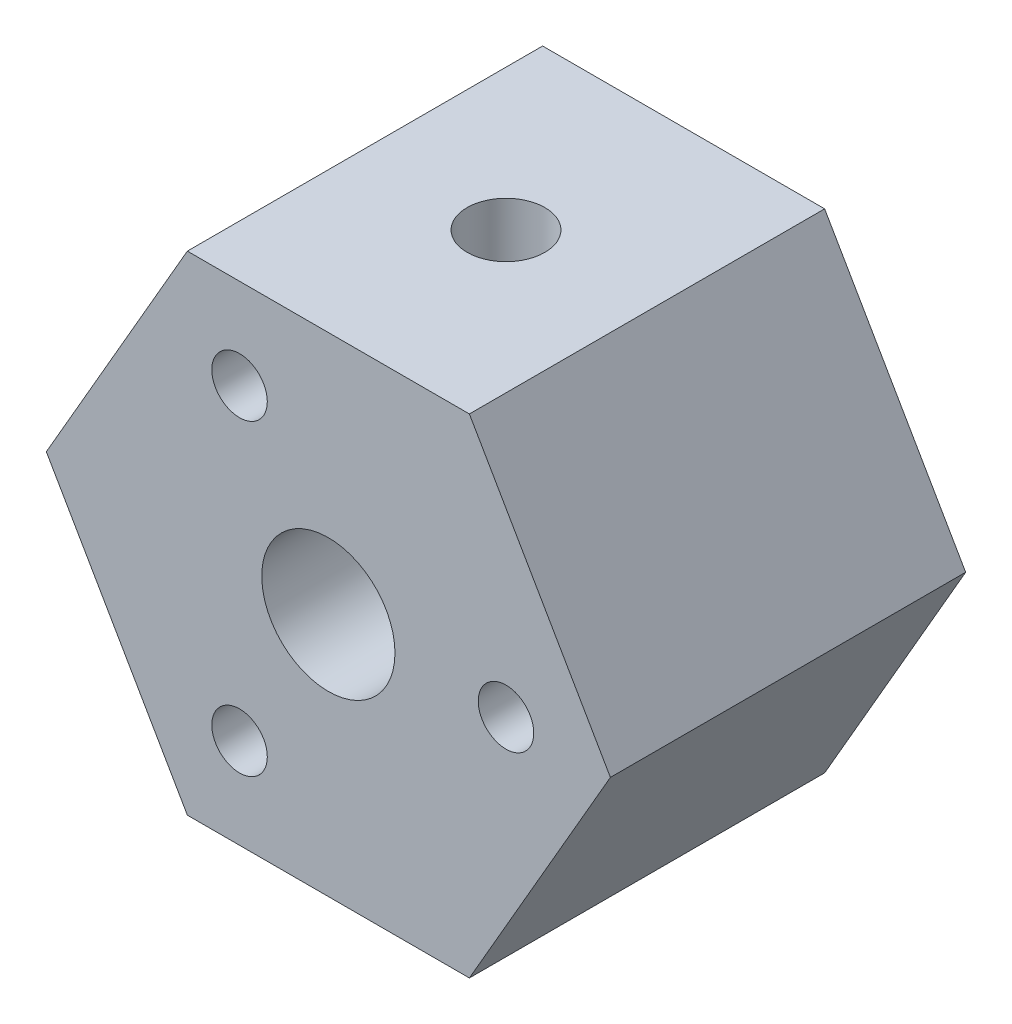
ISO-10303-21;
HEADER;
FILE_DESCRIPTION(('STEP AP214'),'2;1');
FILE_NAME('part.step','',(''),(''),'','','');
FILE_SCHEMA(('AUTOMOTIVE_DESIGN { 1 0 10303 214 1 1 1 1 }'));
ENDSEC;
DATA;
#1=APPLICATION_CONTEXT('core data for automotive mechanical design processes');
#2=APPLICATION_PROTOCOL_DEFINITION('international standard','automotive_design',2000,#1);
#3=PRODUCT_CONTEXT('',#1,'mechanical');
#4=PRODUCT('Part','Part','',(#3));
#5=PRODUCT_RELATED_PRODUCT_CATEGORY('part','',(#4));
#6=PRODUCT_DEFINITION_FORMATION('','',#4);
#7=PRODUCT_DEFINITION_CONTEXT('part definition',#1,'design');
#8=PRODUCT_DEFINITION('design','',#6,#7);
#9=PRODUCT_DEFINITION_SHAPE('','',#8);
#10=(LENGTH_UNIT() NAMED_UNIT(*) SI_UNIT(.MILLI.,.METRE.));
#11=(NAMED_UNIT(*) PLANE_ANGLE_UNIT() SI_UNIT($,.RADIAN.));
#12=(NAMED_UNIT(*) SI_UNIT($,.STERADIAN.) SOLID_ANGLE_UNIT());
#13=UNCERTAINTY_MEASURE_WITH_UNIT(LENGTH_MEASURE(1.E-05),#10,'distance_accuracy_value','');
#14=(GEOMETRIC_REPRESENTATION_CONTEXT(3) GLOBAL_UNCERTAINTY_ASSIGNED_CONTEXT((#13)) GLOBAL_UNIT_ASSIGNED_CONTEXT((#10,
#11,#12)) REPRESENTATION_CONTEXT('',''));
#15=CARTESIAN_POINT('',(0.,0.,0.));
#16=DIRECTION('',(0.,0.,1.));
#17=DIRECTION('',(1.,0.,0.));
#18=AXIS2_PLACEMENT_3D('',#15,#16,#17);
#19=CARTESIAN_POINT('',(0.,0.,16.));
#20=DIRECTION('',(0.,0.,-1.));
#21=DIRECTION('',(-1.,0.,0.));
#22=AXIS2_PLACEMENT_3D('',#19,#20,#21);
#23=CYLINDRICAL_SURFACE('',#22,3.);
#24=CARTESIAN_POINT('',(1.75000000000003,-2.43669858620222,8.));
#25=CARTESIAN_POINT('',(1.75000045184637,-2.43669821091809,8.08863889528146));
#26=CARTESIAN_POINT('',(1.74322391194515,-2.44160788460741,8.17727610566655));
#27=CARTESIAN_POINT('',(1.71658538535332,-2.46040390641729,8.35160919117936));
#28=CARTESIAN_POINT('',(1.6967099102009,-2.47429950740482,8.43730193848041));
#29=CARTESIAN_POINT('',(1.64515183199162,-2.50886819103835,8.60287126283056));
#30=CARTESIAN_POINT('',(1.61354922075019,-2.52949524548536,8.68278295832127));
#31=CARTESIAN_POINT('',(1.53968773008135,-2.57511999485221,8.83613005381451));
#32=CARTESIAN_POINT('',(1.49742543895694,-2.60011908828342,8.90956337019559));
#33=CARTESIAN_POINT('',(1.39777992638198,-2.6551471198592,9.05712914540586));
#34=CARTESIAN_POINT('',(1.33921745197904,-2.68542397458176,9.13037305047407));
#35=CARTESIAN_POINT('',(1.21105723337495,-2.74560714742444,9.26672916596511));
#36=CARTESIAN_POINT('',(1.14145191954032,-2.77551319609255,9.32983436635982));
#37=CARTESIAN_POINT('',(0.984713035802176,-2.83514492694845,9.45036523985617));
#38=CARTESIAN_POINT('',(0.896522073845278,-2.86455244924704,9.50658875248923));
#39=CARTESIAN_POINT('',(0.709891668525868,-2.91640205141093,9.60298275090372));
#40=CARTESIAN_POINT('',(0.611461168794474,-2.93885014282858,9.64316709998003));
#41=CARTESIAN_POINT('',(0.416649273147403,-2.97241689810005,9.70243957405883));
#42=CARTESIAN_POINT('',(0.320901861024355,-2.98438308199891,9.72311932171921));
#43=CARTESIAN_POINT('',(0.126621897573,-2.99890385217236,9.74815170248301));
#44=CARTESIAN_POINT('',(0.0280918555916253,-3.00146666139126,9.75251860070146));
#45=CARTESIAN_POINT('',(-0.156495068538387,-2.99716974401528,9.74514362164978));
#46=CARTESIAN_POINT('',(-0.242658294594978,-2.99138089155147,9.7352327113407));
#47=CARTESIAN_POINT('',(-0.411844523266103,-2.97281444912443,9.70302645014485));
#48=CARTESIAN_POINT('',(-0.494867293660748,-2.96003634341921,9.68073018533203));
#49=CARTESIAN_POINT('',(-0.656364893028908,-2.92848341823655,9.62451791220763));
#50=CARTESIAN_POINT('',(-0.734799910253137,-2.90966331095227,9.5905140051559));
#51=CARTESIAN_POINT('',(-0.884967789919802,-2.86756375772183,9.51212239017886));
#52=CARTESIAN_POINT('',(-0.956698764094629,-2.84428306099948,9.46773176898207));
#53=CARTESIAN_POINT('',(-1.10031993041435,-2.79209374170039,9.36401124963256));
#54=CARTESIAN_POINT('',(-1.17126676062858,-2.76284559232329,9.3035466701393));
#55=CARTESIAN_POINT('',(-1.30259918374286,-2.70341339686187,9.17233444943293));
#56=CARTESIAN_POINT('',(-1.36297110984747,-2.67322819817169,9.10157371463528));
#57=CARTESIAN_POINT('',(-1.47789838153365,-2.61160884024912,8.94282325363876));
#58=CARTESIAN_POINT('',(-1.53115297544717,-2.58038307336383,8.85380162897644));
#59=CARTESIAN_POINT('',(-1.62161168095686,-2.52452387398176,8.66609151711749));
#60=CARTESIAN_POINT('',(-1.65884482652414,-2.49987854748403,8.56742091753687));
#61=CARTESIAN_POINT('',(-1.70853720110658,-2.46608582417188,8.38723400908313));
#62=CARTESIAN_POINT('',(-1.72477506877108,-2.4546504879456,8.3071884246211));
#63=CARTESIAN_POINT('',(-1.74590213357918,-2.43967272746158,8.14491752518462));
#64=CARTESIAN_POINT('',(-1.75080313330492,-2.43612209475394,8.06269456734191));
#65=CARTESIAN_POINT('',(-1.74898039241036,-2.43743053869139,7.89837879671839));
#66=CARTESIAN_POINT('',(-1.74224625907731,-2.44229713376169,7.81628616591415));
#67=CARTESIAN_POINT('',(-1.71753388251392,-2.45973523645838,7.65463785956955));
#68=CARTESIAN_POINT('',(-1.69954714130058,-2.47231256709753,7.57508414919058));
#69=CARTESIAN_POINT('',(-1.65302928692428,-2.50365278676386,7.41981300232488));
#70=CARTESIAN_POINT('',(-1.62442278126805,-2.52245979649396,7.34412750759557));
#71=CARTESIAN_POINT('',(-1.5576569269978,-2.5642256405431,7.198351056267));
#72=CARTESIAN_POINT('',(-1.51949380330517,-2.58718611457638,7.12826232497924));
#73=CARTESIAN_POINT('',(-1.42709875316825,-2.63944389498439,6.98288114369688));
#74=CARTESIAN_POINT('',(-1.37123101284255,-2.66915133905922,6.90877361007517));
#75=CARTESIAN_POINT('',(-1.24852240970031,-2.72870860976122,6.77025848430392));
#76=CARTESIAN_POINT('',(-1.18167183667124,-2.75855853948195,6.70585957330208));
#77=CARTESIAN_POINT('',(-1.02989256043401,-2.81899071549213,6.58137629446211));
#78=CARTESIAN_POINT('',(-0.943778122538562,-2.8492813890616,6.5225803141602));
#79=CARTESIAN_POINT('',(-0.760910913608829,-2.90346015966261,6.4206181998119));
#80=CARTESIAN_POINT('',(-0.66416617741938,-2.92735304610789,6.37744036540367));
#81=CARTESIAN_POINT('',(-0.470674024896558,-2.9643532208793,6.31163710741645));
#82=CARTESIAN_POINT('',(-0.374522814239373,-2.97815986600772,6.28766454631349));
#83=CARTESIAN_POINT('',(-0.178706533702731,-2.9962804721505,6.25633526026649));
#84=CARTESIAN_POINT('',(-0.0790450111450977,-3.00060375186925,6.24896222382968));
#85=CARTESIAN_POINT('',(0.107655929988335,-2.99934002716751,6.25113381764859));
#86=CARTESIAN_POINT('',(0.194734538061914,-2.99491069180817,6.25870210291732));
#87=CARTESIAN_POINT('',(0.366137785941637,-2.97881697494109,6.28652985331473));
#88=CARTESIAN_POINT('',(0.450462322323444,-2.96715232205176,6.30678979448107));
#89=CARTESIAN_POINT('',(0.613761582363603,-2.93771241495244,6.35892953327495));
#90=CARTESIAN_POINT('',(0.692762016439801,-2.91996949045702,6.39074790577612));
#91=CARTESIAN_POINT('',(0.844368647802338,-2.87979165338306,6.46485559813608));
#92=CARTESIAN_POINT('',(0.916973235651973,-2.85735556459278,6.50714754339559));
#93=CARTESIAN_POINT('',(1.06230015031835,-2.80678961708283,6.60623486612087));
#94=CARTESIAN_POINT('',(1.13415977100249,-2.77830505779608,6.66411294922417));
#95=CARTESIAN_POINT('',(1.26772272997668,-2.71996380471867,6.79011398971481));
#96=CARTESIAN_POINT('',(1.32941393272297,-2.69010552501784,6.85824900545822));
#97=CARTESIAN_POINT('',(1.4480520863921,-2.62832782018946,7.01201089040555));
#98=CARTESIAN_POINT('',(1.50365362198234,-2.59656217758449,7.09874664118109));
#99=CARTESIAN_POINT('',(1.59932168084085,-2.53876100901197,7.2821349745036));
#100=CARTESIAN_POINT('',(1.63940729371892,-2.51271845895713,7.37877518492351));
#101=CARTESIAN_POINT('',(1.69663483894559,-2.47435095867368,7.56237960377671));
#102=CARTESIAN_POINT('',(1.7165399134438,-2.46043560953241,7.6481420552006));
#103=CARTESIAN_POINT('',(1.74321337060435,-2.44161571370901,7.82260633197994));
#104=CARTESIAN_POINT('',(1.74999954786264,-2.43669896172808,7.9113040095238));
#105=CARTESIAN_POINT('',(1.75000000000003,-2.43669858620222,8.));
#106=B_SPLINE_CURVE_WITH_KNOTS('',3,(#24,#25,#26,#27,#28,#29,#30,#31,#32,#33,#34,#35,#36,#37,
#38,#39,#40,#41,#42,#43,#44,#45,#46,#47,#48,#49,#50,#51,#52,#53,#54,#55,#56,#57,#58,#59,#60,#61,
#62,#63,#64,#65,#66,#67,#68,#69,#70,#71,#72,#73,#74,#75,#76,#77,#78,#79,#80,#81,#82,#83,#84,#85,
#86,#87,#88,#89,#90,#91,#92,#93,#94,#95,#96,#97,#98,#99,#100,#101,#102,#103,#104,#105),
.UNSPECIFIED.,.T.,.F.,(4,2,2,2,2,2,2,2,2,2,2,2,2,2,2,2,2,2,2,2,2,2,2,2,2,2,2,2,2,2,2,2,2,2,2,2,
2,2,2,2,4),(0.,0.265545218763682,0.531364307474163,0.795402587763074,1.0595254826214,
1.35398659107803,1.64865042554404,1.97283142487701,2.29673161156482,2.5910478996181,
2.88510675625999,3.14464340280145,3.40419920332162,3.66574779852172,3.9273698411442,
4.21928633023893,4.5115773466454,4.83494305243834,5.15772026336276,5.40406403188872,
5.65015122128839,5.89645833389886,6.142951682854,6.39122950133275,6.63960555026167,
6.93078691809871,7.22222712635784,7.5462672305399,7.87006407425508,8.16844648867915,
8.4665355699542,8.72782114336879,8.98911651764958,9.24904312841219,9.50903496080326,
9.79757898950315,10.0864649272872,10.4083273312523,10.7297924718895,10.9958699008298,
11.2615861659037),.UNSPECIFIED.);
#107=CARTESIAN_POINT('',(1.75000000000003,-2.43669858620222,8.));
#108=VERTEX_POINT('',#107);
#109=EDGE_CURVE('E141',#108,#108,#106,.T.);
#110=ORIENTED_EDGE('',*,*,#109,.T.);
#111=EDGE_LOOP('',(#110));
#112=FACE_BOUND('',#111,.T.);
#113=CARTESIAN_POINT('',(0.,0.,16.));
#114=DIRECTION('',(0.,0.,1.));
#115=DIRECTION('',(1.,0.,0.));
#116=AXIS2_PLACEMENT_3D('',#113,#114,#115);
#117=CIRCLE('',#116,3.);
#118=CARTESIAN_POINT('',(3.,0.,16.));
#119=VERTEX_POINT('',#118);
#120=EDGE_CURVE('E129',#119,#119,#117,.T.);
#121=ORIENTED_EDGE('',*,*,#120,.T.);
#122=EDGE_LOOP('',(#121));
#123=FACE_BOUND('',#122,.T.);
#124=CARTESIAN_POINT('',(0.,0.,0.));
#125=DIRECTION('',(0.,0.,1.));
#126=DIRECTION('',(1.,0.,0.));
#127=AXIS2_PLACEMENT_3D('',#124,#125,#126);
#128=CIRCLE('',#127,3.);
#129=CARTESIAN_POINT('',(3.,0.,0.));
#130=VERTEX_POINT('',#129);
#131=EDGE_CURVE('E189',#130,#130,#128,.T.);
#132=ORIENTED_EDGE('',*,*,#131,.F.);
#133=EDGE_LOOP('',(#132));
#134=FACE_BOUND('',#133,.T.);
#135=CARTESIAN_POINT('',(1.74999999999998,2.43669858620226,8.));
#136=CARTESIAN_POINT('',(1.75000045184632,2.43669821091813,7.91136110471855));
#137=CARTESIAN_POINT('',(1.74322391194509,2.44160788460744,7.82272389433345));
#138=CARTESIAN_POINT('',(1.71658538535327,2.46040390641732,7.64839080882064));
#139=CARTESIAN_POINT('',(1.69670991020084,2.47429950740485,7.56269806151959));
#140=CARTESIAN_POINT('',(1.64515183199157,2.50886819103838,7.39712873716944));
#141=CARTESIAN_POINT('',(1.61354922075014,2.5294952454854,7.31721704167874));
#142=CARTESIAN_POINT('',(1.5396877300813,2.57511999485224,7.16386994618549));
#143=CARTESIAN_POINT('',(1.49742543895688,2.60011908828345,7.09043662980441));
#144=CARTESIAN_POINT('',(1.39777992638192,2.65514711985923,6.94287085459414));
#145=CARTESIAN_POINT('',(1.33921745197899,2.68542397458179,6.86962694952593));
#146=CARTESIAN_POINT('',(1.21105723337489,2.74560714742447,6.73327083403489));
#147=CARTESIAN_POINT('',(1.14145191954026,2.77551319609257,6.67016563364018));
#148=CARTESIAN_POINT('',(0.984713035802116,2.83514492694847,6.54963476014383));
#149=CARTESIAN_POINT('',(0.896522073845218,2.86455244924706,6.49341124751077));
#150=CARTESIAN_POINT('',(0.709891668525806,2.91640205141094,6.39701724909628));
#151=CARTESIAN_POINT('',(0.611461168794412,2.9388501428286,6.35683290001997));
#152=CARTESIAN_POINT('',(0.41664927314734,2.97241689810006,6.29756042594118));
#153=CARTESIAN_POINT('',(0.320901861024292,2.98438308199892,6.27688067828079));
#154=CARTESIAN_POINT('',(0.126621897572937,2.99890385217237,6.25184829751699));
#155=CARTESIAN_POINT('',(0.0280918555915622,3.00146666139126,6.24748139929854));
#156=CARTESIAN_POINT('',(-0.15649506853845,2.99716974401528,6.25485637835022));
#157=CARTESIAN_POINT('',(-0.242658294595041,2.99138089155147,6.2647672886593));
#158=CARTESIAN_POINT('',(-0.411844523266166,2.97281444912442,6.29697354985515));
#159=CARTESIAN_POINT('',(-0.49486729366081,2.9600363434192,6.31926981466797));
#160=CARTESIAN_POINT('',(-0.65636489302897,2.92848341823654,6.37548208779237));
#161=CARTESIAN_POINT('',(-0.734799910253198,2.90966331095225,6.4094859948441));
#162=CARTESIAN_POINT('',(-0.884967789919862,2.86756375772182,6.48787760982114));
#163=CARTESIAN_POINT('',(-0.956698764094689,2.84428306099946,6.53226823101793));
#164=CARTESIAN_POINT('',(-1.10031993041441,2.79209374170036,6.63598875036744));
#165=CARTESIAN_POINT('',(-1.17126676062863,2.76284559232327,6.6964533298607));
#166=CARTESIAN_POINT('',(-1.30259918374292,2.70341339686185,6.82766555056707));
#167=CARTESIAN_POINT('',(-1.36297110984752,2.67322819817166,6.89842628536472));
#168=CARTESIAN_POINT('',(-1.47789838153371,2.61160884024909,7.05717674636124));
#169=CARTESIAN_POINT('',(-1.53115297544722,2.5803830733638,7.14619837102356));
#170=CARTESIAN_POINT('',(-1.62161168095691,2.52452387398173,7.33390848288251));
#171=CARTESIAN_POINT('',(-1.65884482652419,2.499878547484,7.43257908246313));
#172=CARTESIAN_POINT('',(-1.70853720110663,2.46608582417185,7.61276599091687));
#173=CARTESIAN_POINT('',(-1.72477506877113,2.45465048794557,7.69281157537891));
#174=CARTESIAN_POINT('',(-1.74590213357923,2.43967272746154,7.85508247481538));
#175=CARTESIAN_POINT('',(-1.75080313330497,2.4361220947539,7.9373054326581));
#176=CARTESIAN_POINT('',(-1.74898039241041,2.43743053869136,8.10162120328162));
#177=CARTESIAN_POINT('',(-1.74224625907736,2.44229713376165,8.18371383408586));
#178=CARTESIAN_POINT('',(-1.71753388251397,2.45973523645835,8.34536214043046));
#179=CARTESIAN_POINT('',(-1.69954714130063,2.47231256709749,8.42491585080943));
#180=CARTESIAN_POINT('',(-1.65302928692433,2.50365278676383,8.58018699767513));
#181=CARTESIAN_POINT('',(-1.6244227812681,2.52245979649393,8.65587249240443));
#182=CARTESIAN_POINT('',(-1.55765692699785,2.56422564054307,8.801648943733));
#183=CARTESIAN_POINT('',(-1.51949380330522,2.58718611457635,8.87173767502077));
#184=CARTESIAN_POINT('',(-1.4270987531683,2.63944389498436,9.01711885630312));
#185=CARTESIAN_POINT('',(-1.3712310128426,2.6691513390592,9.09122638992484));
#186=CARTESIAN_POINT('',(-1.24852240970036,2.72870860976119,9.22974151569609));
#187=CARTESIAN_POINT('',(-1.18167183667129,2.75855853948193,9.29414042669793));
#188=CARTESIAN_POINT('',(-1.02989256043406,2.81899071549211,9.41862370553789));
#189=CARTESIAN_POINT('',(-0.943778122538613,2.84928138906159,9.47741968583981));
#190=CARTESIAN_POINT('',(-0.760910913608881,2.9034601596626,9.5793818001881));
#191=CARTESIAN_POINT('',(-0.664166177419432,2.92735304610787,9.62255963459634));
#192=CARTESIAN_POINT('',(-0.470674024896611,2.96435322087929,9.68836289258356));
#193=CARTESIAN_POINT('',(-0.374522814239426,2.97815986600771,9.71233545368651));
#194=CARTESIAN_POINT('',(-0.178706533702783,2.9962804721505,9.74366473973351));
#195=CARTESIAN_POINT('',(-0.0790450111451509,3.00060375186924,9.75103777617032));
#196=CARTESIAN_POINT('',(0.107655929988282,2.99934002716751,9.74886618235142));
#197=CARTESIAN_POINT('',(0.194734538061861,2.99491069180818,9.74129789708268));
#198=CARTESIAN_POINT('',(0.366137785941584,2.9788169749411,9.71347014668527));
#199=CARTESIAN_POINT('',(0.45046232232339,2.96715232205177,9.69321020551892));
#200=CARTESIAN_POINT('',(0.613761582363549,2.93771241495245,9.64107046672505));
#201=CARTESIAN_POINT('',(0.692762016439749,2.91996949045704,9.60925209422388));
#202=CARTESIAN_POINT('',(0.844368647802286,2.87979165338308,9.53514440186392));
#203=CARTESIAN_POINT('',(0.916973235651922,2.8573555645928,9.4928524566044));
#204=CARTESIAN_POINT('',(1.0623001503183,2.80678961708285,9.39376513387912));
#205=CARTESIAN_POINT('',(1.13415977100243,2.7783050577961,9.33588705077582));
#206=CARTESIAN_POINT('',(1.26772272997663,2.71996380471869,9.20988601028518));
#207=CARTESIAN_POINT('',(1.32941393272292,2.69010552501787,9.14175099454177));
#208=CARTESIAN_POINT('',(1.44805208639205,2.62832782018949,8.98798910959444));
#209=CARTESIAN_POINT('',(1.50365362198229,2.59656217758452,8.9012533588189));
#210=CARTESIAN_POINT('',(1.5993216808408,2.538761009012,8.71786502549639));
#211=CARTESIAN_POINT('',(1.63940729371887,2.51271845895716,8.62122481507648));
#212=CARTESIAN_POINT('',(1.69663483894554,2.47435095867372,8.43762039622329));
#213=CARTESIAN_POINT('',(1.71653991344374,2.46043560953245,8.35185794479939));
#214=CARTESIAN_POINT('',(1.7432133706043,2.44161571370905,8.17739366802005));
#215=CARTESIAN_POINT('',(1.74999954786259,2.43669896172812,8.0886959904762));
#216=CARTESIAN_POINT('',(1.74999999999998,2.43669858620226,8.));
#217=B_SPLINE_CURVE_WITH_KNOTS('',3,(#135,#136,#137,#138,#139,#140,#141,#142,#143,#144,#145,
#146,#147,#148,#149,#150,#151,#152,#153,#154,#155,#156,#157,#158,#159,#160,#161,#162,#163,#164,
#165,#166,#167,#168,#169,#170,#171,#172,#173,#174,#175,#176,#177,#178,#179,#180,#181,#182,#183,
#184,#185,#186,#187,#188,#189,#190,#191,#192,#193,#194,#195,#196,#197,#198,#199,#200,#201,#202,
#203,#204,#205,#206,#207,#208,#209,#210,#211,#212,#213,#214,#215,#216),.UNSPECIFIED.,.T.,.F.,(4,
2,2,2,2,2,2,2,2,2,2,2,2,2,2,2,2,2,2,2,2,2,2,2,2,2,2,2,2,2,2,2,2,2,2,2,2,2,2,2,4),(0.,
0.265545218763684,0.531364307474163,0.795402587763073,1.05952548262139,1.35398659107802,
1.64865042554405,1.97283142487701,2.29673161156483,2.5910478996181,2.88510675625999,
3.14464340280145,3.40419920332162,3.66574779852172,3.9273698411442,4.21928633023893,
4.5115773466454,4.83494305243834,5.15772026336277,5.40406403188873,5.6501512212884,
5.89645833389887,6.14295168285401,6.39122950133276,6.63960555026168,6.93078691809872,
7.22222712635786,7.54626723053992,7.87006407425509,8.16844648867916,8.46653556995421,
8.7278211433688,8.98911651764959,9.2490431284122,9.50903496080327,9.79757898950316,
10.0864649272872,10.4083273312523,10.7297924718895,10.9958699008298,11.2615861659037),.UNSPECIFIED.);
#218=CARTESIAN_POINT('',(1.74999999999998,2.43669858620226,8.));
#219=VERTEX_POINT('',#218);
#220=EDGE_CURVE('E37',#219,#219,#217,.T.);
#221=ORIENTED_EDGE('',*,*,#220,.T.);
#222=EDGE_LOOP('',(#221));
#223=FACE_BOUND('',#222,.T.);
#224=ADVANCED_FACE('F33',(#112,#123,#134,#223),#23,.F.);
#225=CARTESIAN_POINT('',(0.,0.,16.));
#226=DIRECTION('',(0.,0.,1.));
#227=DIRECTION('',(1.,0.,0.));
#228=AXIS2_PLACEMENT_3D('',#225,#226,#227);
#229=PLANE('',#228);
#230=CARTESIAN_POINT('',(8.,0.,16.));
#231=DIRECTION('',(0.,0.,1.));
#232=DIRECTION('',(1.,0.,0.));
#233=AXIS2_PLACEMENT_3D('',#230,#231,#232);
#234=CIRCLE('',#233,1.25);
#235=CARTESIAN_POINT('',(9.25,0.,16.));
#236=VERTEX_POINT('',#235);
#237=EDGE_CURVE('E204',#236,#236,#234,.T.);
#238=ORIENTED_EDGE('',*,*,#237,.F.);
#239=EDGE_LOOP('',(#238));
#240=FACE_BOUND('',#239,.T.);
#241=ORIENTED_EDGE('',*,*,#120,.F.);
#242=EDGE_LOOP('',(#241));
#243=FACE_BOUND('',#242,.T.);
#244=DIRECTION('',(0.499999999999995,0.866025403784441,0.));
#245=VECTOR('',#244,1.);
#246=CARTESIAN_POINT('',(6.35085296108599,-10.9999999999999,16.));
#247=LINE('',#246,#245);
#248=CARTESIAN_POINT('',(6.35085296108599,-10.9999999999999,16.));
#249=VERTEX_POINT('',#248);
#250=CARTESIAN_POINT('',(12.7017059221717,0.,16.));
#251=VERTEX_POINT('',#250);
#252=EDGE_CURVE('E136',#249,#251,#247,.T.);
#253=ORIENTED_EDGE('',*,*,#252,.T.);
#254=DIRECTION('',(-0.500000000000001,0.866025403784438,0.));
#255=VECTOR('',#254,1.);
#256=CARTESIAN_POINT('',(12.7017059221717,0.,16.));
#257=LINE('',#256,#255);
#258=CARTESIAN_POINT('',(6.35085296108583,11.,16.));
#259=VERTEX_POINT('',#258);
#260=EDGE_CURVE('E93',#251,#259,#257,.T.);
#261=ORIENTED_EDGE('',*,*,#260,.T.);
#262=DIRECTION('',(-1.,0.,0.));
#263=VECTOR('',#262,1.);
#264=CARTESIAN_POINT('',(6.35085296108583,11.,16.));
#265=LINE('',#264,#263);
#266=CARTESIAN_POINT('',(-6.35085296108591,10.9999999999999,16.));
#267=VERTEX_POINT('',#266);
#268=EDGE_CURVE('E107',#259,#267,#265,.T.);
#269=ORIENTED_EDGE('',*,*,#268,.T.);
#270=DIRECTION('',(-0.499999999999995,-0.866025403784442,0.));
#271=VECTOR('',#270,1.);
#272=CARTESIAN_POINT('',(-6.35085296108591,10.9999999999999,16.));
#273=LINE('',#272,#271);
#274=CARTESIAN_POINT('',(-12.7017059221717,0.,16.));
#275=VERTEX_POINT('',#274);
#276=EDGE_CURVE('E100',#267,#275,#273,.T.);
#277=ORIENTED_EDGE('',*,*,#276,.T.);
#278=DIRECTION('',(0.500000000000007,-0.866025403784435,0.));
#279=VECTOR('',#278,1.);
#280=CARTESIAN_POINT('',(-12.7017059221717,0.,16.));
#281=LINE('',#280,#279);
#282=CARTESIAN_POINT('',(-6.35085296108576,-11.,16.));
#283=VERTEX_POINT('',#282);
#284=EDGE_CURVE('E105',#275,#283,#281,.T.);
#285=ORIENTED_EDGE('',*,*,#284,.T.);
#286=DIRECTION('',(1.,0.,0.));
#287=VECTOR('',#286,1.);
#288=CARTESIAN_POINT('',(-6.35085296108576,-11.,16.));
#289=LINE('',#288,#287);
#290=EDGE_CURVE('E56',#283,#249,#289,.T.);
#291=ORIENTED_EDGE('',*,*,#290,.T.);
#292=EDGE_LOOP('',(#253,#261,#269,#277,#285,#291));
#293=FACE_BOUND('',#292,.T.);
#294=CARTESIAN_POINT('',(-4.00000000000001,-6.9282032302755,16.));
#295=DIRECTION('',(0.,0.,1.));
#296=DIRECTION('',(1.,0.,0.));
#297=AXIS2_PLACEMENT_3D('',#294,#295,#296);
#298=CIRCLE('',#297,1.25);
#299=CARTESIAN_POINT('',(-2.75000000000001,-6.9282032302755,16.));
#300=VERTEX_POINT('',#299);
#301=EDGE_CURVE('E210',#300,#300,#298,.T.);
#302=ORIENTED_EDGE('',*,*,#301,.F.);
#303=EDGE_LOOP('',(#302));
#304=FACE_BOUND('',#303,.T.);
#305=CARTESIAN_POINT('',(-4.00000000000002,6.9282032302755,16.));
#306=DIRECTION('',(0.,0.,1.));
#307=DIRECTION('',(1.,0.,0.));
#308=AXIS2_PLACEMENT_3D('',#305,#306,#307);
#309=CIRCLE('',#308,1.25);
#310=CARTESIAN_POINT('',(-2.75000000000002,6.9282032302755,16.));
#311=VERTEX_POINT('',#310);
#312=EDGE_CURVE('E195',#311,#311,#309,.T.);
#313=ORIENTED_EDGE('',*,*,#312,.F.);
#314=EDGE_LOOP('',(#313));
#315=FACE_BOUND('',#314,.T.);
#316=ADVANCED_FACE('F102',(#240,#243,#293,#304,#315),#229,.T.);
#317=CARTESIAN_POINT('',(0.,0.,0.));
#318=DIRECTION('',(0.,0.,1.));
#319=DIRECTION('',(1.,0.,0.));
#320=AXIS2_PLACEMENT_3D('',#317,#318,#319);
#321=PLANE('',#320);
#322=DIRECTION('',(0.499999999999995,0.866025403784441,0.));
#323=VECTOR('',#322,1.);
#324=CARTESIAN_POINT('',(6.35085296108599,-10.9999999999999,0.));
#325=LINE('',#324,#323);
#326=CARTESIAN_POINT('',(6.35085296108599,-10.9999999999999,0.));
#327=VERTEX_POINT('',#326);
#328=CARTESIAN_POINT('',(12.7017059221717,0.,0.));
#329=VERTEX_POINT('',#328);
#330=EDGE_CURVE('E125',#327,#329,#325,.T.);
#331=ORIENTED_EDGE('',*,*,#330,.F.);
#332=DIRECTION('',(1.,0.,0.));
#333=VECTOR('',#332,1.);
#334=CARTESIAN_POINT('',(-6.35085296108576,-11.,0.));
#335=LINE('',#334,#333);
#336=CARTESIAN_POINT('',(-6.35085296108576,-11.,0.));
#337=VERTEX_POINT('',#336);
#338=EDGE_CURVE('E85',#337,#327,#335,.T.);
#339=ORIENTED_EDGE('',*,*,#338,.F.);
#340=DIRECTION('',(0.500000000000007,-0.866025403784435,0.));
#341=VECTOR('',#340,1.);
#342=CARTESIAN_POINT('',(-12.7017059221717,0.,0.));
#343=LINE('',#342,#341);
#344=CARTESIAN_POINT('',(-12.7017059221717,0.,0.));
#345=VERTEX_POINT('',#344);
#346=EDGE_CURVE('E79',#345,#337,#343,.T.);
#347=ORIENTED_EDGE('',*,*,#346,.F.);
#348=DIRECTION('',(-0.499999999999995,-0.866025403784442,0.));
#349=VECTOR('',#348,1.);
#350=CARTESIAN_POINT('',(-6.35085296108591,10.9999999999999,0.));
#351=LINE('',#350,#349);
#352=CARTESIAN_POINT('',(-6.35085296108591,10.9999999999999,0.));
#353=VERTEX_POINT('',#352);
#354=EDGE_CURVE('E115',#353,#345,#351,.T.);
#355=ORIENTED_EDGE('',*,*,#354,.F.);
#356=DIRECTION('',(-1.,0.,0.));
#357=VECTOR('',#356,1.);
#358=CARTESIAN_POINT('',(6.35085296108583,11.,0.));
#359=LINE('',#358,#357);
#360=CARTESIAN_POINT('',(6.35085296108583,11.,0.));
#361=VERTEX_POINT('',#360);
#362=EDGE_CURVE('E131',#361,#353,#359,.T.);
#363=ORIENTED_EDGE('',*,*,#362,.F.);
#364=DIRECTION('',(-0.500000000000001,0.866025403784438,0.));
#365=VECTOR('',#364,1.);
#366=CARTESIAN_POINT('',(12.7017059221717,0.,0.));
#367=LINE('',#366,#365);
#368=EDGE_CURVE('E128',#329,#361,#367,.T.);
#369=ORIENTED_EDGE('',*,*,#368,.F.);
#370=EDGE_LOOP('',(#331,#339,#347,#355,#363,#369));
#371=FACE_BOUND('',#370,.T.);
#372=ORIENTED_EDGE('',*,*,#131,.T.);
#373=EDGE_LOOP('',(#372));
#374=FACE_BOUND('',#373,.T.);
#375=CARTESIAN_POINT('',(-4.00000000000001,-6.9282032302755,0.));
#376=DIRECTION('',(0.,0.,1.));
#377=DIRECTION('',(1.,0.,0.));
#378=AXIS2_PLACEMENT_3D('',#375,#376,#377);
#379=CIRCLE('',#378,1.25);
#380=CARTESIAN_POINT('',(-2.75000000000001,-6.9282032302755,0.));
#381=VERTEX_POINT('',#380);
#382=EDGE_CURVE('E207',#381,#381,#379,.T.);
#383=ORIENTED_EDGE('',*,*,#382,.T.);
#384=EDGE_LOOP('',(#383));
#385=FACE_BOUND('',#384,.T.);
#386=CARTESIAN_POINT('',(8.,0.,0.));
#387=DIRECTION('',(0.,0.,1.));
#388=DIRECTION('',(1.,0.,0.));
#389=AXIS2_PLACEMENT_3D('',#386,#387,#388);
#390=CIRCLE('',#389,1.25);
#391=CARTESIAN_POINT('',(9.25,0.,0.));
#392=VERTEX_POINT('',#391);
#393=EDGE_CURVE('E200',#392,#392,#390,.T.);
#394=ORIENTED_EDGE('',*,*,#393,.T.);
#395=EDGE_LOOP('',(#394));
#396=FACE_BOUND('',#395,.T.);
#397=CARTESIAN_POINT('',(-4.00000000000002,6.9282032302755,0.));
#398=DIRECTION('',(0.,0.,1.));
#399=DIRECTION('',(1.,0.,0.));
#400=AXIS2_PLACEMENT_3D('',#397,#398,#399);
#401=CIRCLE('',#400,1.25);
#402=CARTESIAN_POINT('',(-2.75000000000002,6.9282032302755,0.));
#403=VERTEX_POINT('',#402);
#404=EDGE_CURVE('E193',#403,#403,#401,.T.);
#405=ORIENTED_EDGE('',*,*,#404,.T.);
#406=EDGE_LOOP('',(#405));
#407=FACE_BOUND('',#406,.T.);
#408=ADVANCED_FACE('F179',(#371,#374,#385,#396,#407),#321,.F.);
#409=CARTESIAN_POINT('',(6.35085296108599,-10.9999999999999,16.));
#410=DIRECTION('',(-0.866025403784442,0.499999999999995,0.));
#411=DIRECTION('',(-0.499999999999995,-0.866025403784442,0.));
#412=AXIS2_PLACEMENT_3D('',#409,#410,#411);
#413=PLANE('',#412);
#414=ORIENTED_EDGE('',*,*,#330,.T.);
#415=DIRECTION('',(0.,0.,-1.));
#416=VECTOR('',#415,1.);
#417=CARTESIAN_POINT('',(12.7017059221717,0.,16.));
#418=LINE('',#417,#416);
#419=EDGE_CURVE('E11',#251,#329,#418,.T.);
#420=ORIENTED_EDGE('',*,*,#419,.F.);
#421=ORIENTED_EDGE('',*,*,#252,.F.);
#422=DIRECTION('',(0.,0.,-1.));
#423=VECTOR('',#422,1.);
#424=CARTESIAN_POINT('',(6.35085296108599,-10.9999999999999,16.));
#425=LINE('',#424,#423);
#426=EDGE_CURVE('E121',#249,#327,#425,.T.);
#427=ORIENTED_EDGE('',*,*,#426,.T.);
#428=EDGE_LOOP('',(#414,#420,#421,#427));
#429=FACE_BOUND('',#428,.T.);
#430=ADVANCED_FACE('F35',(#429),#413,.F.);
#431=CARTESIAN_POINT('',(12.7017059221717,0.,16.));
#432=DIRECTION('',(-0.866025403784438,-0.500000000000001,0.));
#433=DIRECTION('',(0.500000000000001,-0.866025403784438,0.));
#434=AXIS2_PLACEMENT_3D('',#431,#432,#433);
#435=PLANE('',#434);
#436=ORIENTED_EDGE('',*,*,#368,.T.);
#437=DIRECTION('',(0.,0.,-1.));
#438=VECTOR('',#437,1.);
#439=CARTESIAN_POINT('',(6.35085296108583,11.,16.));
#440=LINE('',#439,#438);
#441=EDGE_CURVE('E47',#259,#361,#440,.T.);
#442=ORIENTED_EDGE('',*,*,#441,.F.);
#443=ORIENTED_EDGE('',*,*,#260,.F.);
#444=ORIENTED_EDGE('',*,*,#419,.T.);
#445=EDGE_LOOP('',(#436,#442,#443,#444));
#446=FACE_BOUND('',#445,.T.);
#447=ADVANCED_FACE('F219',(#446),#435,.F.);
#448=CARTESIAN_POINT('',(6.35085296108583,11.,16.));
#449=DIRECTION('',(0.,-1.,0.));
#450=DIRECTION('',(1.,0.,0.));
#451=AXIS2_PLACEMENT_3D('',#448,#449,#450);
#452=PLANE('',#451);
#453=CARTESIAN_POINT('',(-1.10390622641624E-13,11.0000000000001,8.));
#454=DIRECTION('',(0.,1.,0.));
#455=DIRECTION('',(-1.,0.,0.));
#456=AXIS2_PLACEMENT_3D('',#453,#454,#455);
#457=CIRCLE('',#456,1.75);
#458=CARTESIAN_POINT('',(-1.75000000000011,11.0000000000001,8.));
#459=VERTEX_POINT('',#458);
#460=EDGE_CURVE('E145',#459,#459,#457,.T.);
#461=ORIENTED_EDGE('',*,*,#460,.F.);
#462=EDGE_LOOP('',(#461));
#463=FACE_BOUND('',#462,.T.);
#464=ORIENTED_EDGE('',*,*,#362,.T.);
#465=DIRECTION('',(0.,0.,-1.));
#466=VECTOR('',#465,1.);
#467=CARTESIAN_POINT('',(-6.35085296108591,10.9999999999999,16.));
#468=LINE('',#467,#466);
#469=EDGE_CURVE('E116',#267,#353,#468,.T.);
#470=ORIENTED_EDGE('',*,*,#469,.F.);
#471=ORIENTED_EDGE('',*,*,#268,.F.);
#472=ORIENTED_EDGE('',*,*,#441,.T.);
#473=EDGE_LOOP('',(#464,#470,#471,#472));
#474=FACE_BOUND('',#473,.T.);
#475=ADVANCED_FACE('F222',(#463,#474),#452,.F.);
#476=CARTESIAN_POINT('',(-6.35085296108591,10.9999999999999,16.));
#477=DIRECTION('',(0.866025403784442,-0.499999999999995,0.));
#478=DIRECTION('',(0.499999999999995,0.866025403784442,0.));
#479=AXIS2_PLACEMENT_3D('',#476,#477,#478);
#480=PLANE('',#479);
#481=ORIENTED_EDGE('',*,*,#354,.T.);
#482=DIRECTION('',(0.,0.,-1.));
#483=VECTOR('',#482,1.);
#484=CARTESIAN_POINT('',(-12.7017059221717,0.,16.));
#485=LINE('',#484,#483);
#486=EDGE_CURVE('E112',#275,#345,#485,.T.);
#487=ORIENTED_EDGE('',*,*,#486,.F.);
#488=ORIENTED_EDGE('',*,*,#276,.F.);
#489=ORIENTED_EDGE('',*,*,#469,.T.);
#490=EDGE_LOOP('',(#481,#487,#488,#489));
#491=FACE_BOUND('',#490,.T.);
#492=ADVANCED_FACE('F113',(#491),#480,.F.);
#493=CARTESIAN_POINT('',(-12.7017059221717,0.,16.));
#494=DIRECTION('',(0.866025403784435,0.500000000000007,0.));
#495=DIRECTION('',(-0.500000000000007,0.866025403784435,0.));
#496=AXIS2_PLACEMENT_3D('',#493,#494,#495);
#497=PLANE('',#496);
#498=ORIENTED_EDGE('',*,*,#346,.T.);
#499=DIRECTION('',(0.,0.,-1.));
#500=VECTOR('',#499,1.);
#501=CARTESIAN_POINT('',(-6.35085296108576,-11.,16.));
#502=LINE('',#501,#500);
#503=EDGE_CURVE('E117',#283,#337,#502,.T.);
#504=ORIENTED_EDGE('',*,*,#503,.F.);
#505=ORIENTED_EDGE('',*,*,#284,.F.);
#506=ORIENTED_EDGE('',*,*,#486,.T.);
#507=EDGE_LOOP('',(#498,#504,#505,#506));
#508=FACE_BOUND('',#507,.T.);
#509=ADVANCED_FACE('F119',(#508),#497,.F.);
#510=CARTESIAN_POINT('',(-6.35085296108576,-11.,16.));
#511=DIRECTION('',(0.,1.,0.));
#512=DIRECTION('',(-1.,0.,0.));
#513=AXIS2_PLACEMENT_3D('',#510,#511,#512);
#514=PLANE('',#513);
#515=CARTESIAN_POINT('',(1.17961196366423E-13,-10.9999999999997,8.));
#516=DIRECTION('',(0.,1.,0.));
#517=DIRECTION('',(-1.,0.,0.));
#518=AXIS2_PLACEMENT_3D('',#515,#516,#517);
#519=CIRCLE('',#518,1.75);
#520=CARTESIAN_POINT('',(-1.74999999999988,-10.9999999999997,8.));
#521=VERTEX_POINT('',#520);
#522=EDGE_CURVE('E247',#521,#521,#519,.T.);
#523=ORIENTED_EDGE('',*,*,#522,.T.);
#524=EDGE_LOOP('',(#523));
#525=FACE_BOUND('',#524,.T.);
#526=ORIENTED_EDGE('',*,*,#338,.T.);
#527=ORIENTED_EDGE('',*,*,#426,.F.);
#528=ORIENTED_EDGE('',*,*,#290,.F.);
#529=ORIENTED_EDGE('',*,*,#503,.T.);
#530=EDGE_LOOP('',(#526,#527,#528,#529));
#531=FACE_BOUND('',#530,.T.);
#532=ADVANCED_FACE('F165',(#525,#531),#514,.F.);
#533=CARTESIAN_POINT('',(-4.00000000000001,-6.9282032302755,16.));
#534=DIRECTION('',(0.,0.,-1.));
#535=DIRECTION('',(-1.,0.,0.));
#536=AXIS2_PLACEMENT_3D('',#533,#534,#535);
#537=CYLINDRICAL_SURFACE('',#536,1.25);
#538=ORIENTED_EDGE('',*,*,#301,.T.);
#539=EDGE_LOOP('',(#538));
#540=FACE_BOUND('',#539,.T.);
#541=ORIENTED_EDGE('',*,*,#382,.F.);
#542=EDGE_LOOP('',(#541));
#543=FACE_BOUND('',#542,.T.);
#544=ADVANCED_FACE('F162',(#540,#543),#537,.F.);
#545=CARTESIAN_POINT('',(8.,0.,16.));
#546=DIRECTION('',(0.,0.,-1.));
#547=DIRECTION('',(-1.,0.,0.));
#548=AXIS2_PLACEMENT_3D('',#545,#546,#547);
#549=CYLINDRICAL_SURFACE('',#548,1.25);
#550=ORIENTED_EDGE('',*,*,#237,.T.);
#551=EDGE_LOOP('',(#550));
#552=FACE_BOUND('',#551,.T.);
#553=ORIENTED_EDGE('',*,*,#393,.F.);
#554=EDGE_LOOP('',(#553));
#555=FACE_BOUND('',#554,.T.);
#556=ADVANCED_FACE('F159',(#552,#555),#549,.F.);
#557=CARTESIAN_POINT('',(-4.00000000000002,6.9282032302755,16.));
#558=DIRECTION('',(0.,0.,-1.));
#559=DIRECTION('',(-1.,0.,0.));
#560=AXIS2_PLACEMENT_3D('',#557,#558,#559);
#561=CYLINDRICAL_SURFACE('',#560,1.25);
#562=ORIENTED_EDGE('',*,*,#312,.T.);
#563=EDGE_LOOP('',(#562));
#564=FACE_BOUND('',#563,.T.);
#565=ORIENTED_EDGE('',*,*,#404,.F.);
#566=EDGE_LOOP('',(#565));
#567=FACE_BOUND('',#566,.T.);
#568=ADVANCED_FACE('F154',(#564,#567),#561,.F.);
#569=CARTESIAN_POINT('',(-1.10390622641624E-13,11.0000000000001,8.));
#570=DIRECTION('',(0.,-1.,0.));
#571=DIRECTION('',(1.,0.,0.));
#572=AXIS2_PLACEMENT_3D('',#569,#570,#571);
#573=CYLINDRICAL_SURFACE('',#572,1.75);
#574=ORIENTED_EDGE('',*,*,#109,.F.);
#575=EDGE_LOOP('',(#574));
#576=FACE_BOUND('',#575,.T.);
#577=ORIENTED_EDGE('',*,*,#522,.F.);
#578=EDGE_LOOP('',(#577));
#579=FACE_BOUND('',#578,.T.);
#580=ADVANCED_FACE('F149',(#576,#579),#573,.F.);
#581=ORIENTED_EDGE('',*,*,#220,.F.);
#582=EDGE_LOOP('',(#581));
#583=FACE_BOUND('',#582,.T.);
#584=ORIENTED_EDGE('',*,*,#460,.T.);
#585=EDGE_LOOP('',(#584));
#586=FACE_BOUND('',#585,.T.);
#587=ADVANCED_FACE('F153',(#583,#586),#573,.F.);
#588=CLOSED_SHELL('',(#224,#316,#408,#430,#447,#475,#492,#509,#532,#544,#556,#568,#580,#587));
#589=MANIFOLD_SOLID_BREP('B2',#588);
#590=ADVANCED_BREP_SHAPE_REPRESENTATION('',(#18,#589),#14);
#591=SHAPE_DEFINITION_REPRESENTATION(#9,#590);
ENDSEC;
END-ISO-10303-21;
